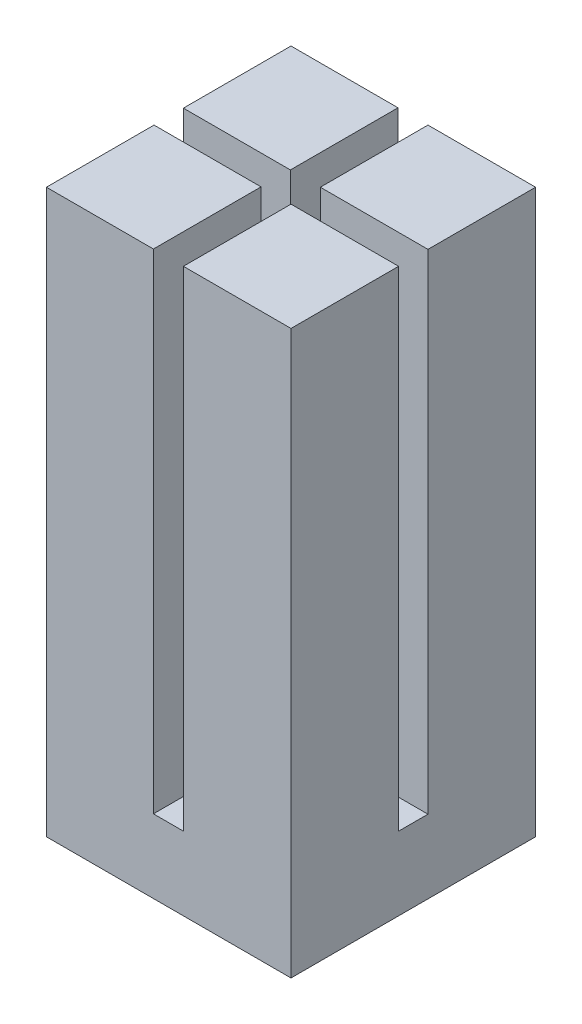
ISO-10303-21;
HEADER;
FILE_DESCRIPTION(('STEP AP214'),'2;1');
FILE_NAME('part.step','',(''),(''),'','','');
FILE_SCHEMA(('AUTOMOTIVE_DESIGN { 1 0 10303 214 1 1 1 1 }'));
ENDSEC;
DATA;
#1=APPLICATION_CONTEXT('core data for automotive mechanical design processes');
#2=APPLICATION_PROTOCOL_DEFINITION('international standard','automotive_design',2000,#1);
#3=PRODUCT_CONTEXT('',#1,'mechanical');
#4=PRODUCT('Part','Part','',(#3));
#5=PRODUCT_RELATED_PRODUCT_CATEGORY('part','',(#4));
#6=PRODUCT_DEFINITION_FORMATION('','',#4);
#7=PRODUCT_DEFINITION_CONTEXT('part definition',#1,'design');
#8=PRODUCT_DEFINITION('design','',#6,#7);
#9=PRODUCT_DEFINITION_SHAPE('','',#8);
#10=(LENGTH_UNIT() NAMED_UNIT(*) SI_UNIT(.MILLI.,.METRE.));
#11=(NAMED_UNIT(*) PLANE_ANGLE_UNIT() SI_UNIT($,.RADIAN.));
#12=(NAMED_UNIT(*) SI_UNIT($,.STERADIAN.) SOLID_ANGLE_UNIT());
#13=UNCERTAINTY_MEASURE_WITH_UNIT(LENGTH_MEASURE(1.E-05),#10,'distance_accuracy_value','');
#14=(GEOMETRIC_REPRESENTATION_CONTEXT(3) GLOBAL_UNCERTAINTY_ASSIGNED_CONTEXT((#13)) GLOBAL_UNIT_ASSIGNED_CONTEXT((#10,
#11,#12)) REPRESENTATION_CONTEXT('',''));
#15=CARTESIAN_POINT('',(0.,0.,0.));
#16=DIRECTION('',(0.,0.,1.));
#17=DIRECTION('',(1.,0.,0.));
#18=AXIS2_PLACEMENT_3D('',#15,#16,#17);
#19=CARTESIAN_POINT('',(-12.7,50.8,0.));
#20=DIRECTION('',(1.,0.,0.));
#21=DIRECTION('',(0.,0.,-1.));
#22=AXIS2_PLACEMENT_3D('',#19,#20,#21);
#23=PLANE('',#22);
#24=DIRECTION('',(0.,-1.,0.));
#25=VECTOR('',#24,1.);
#26=CARTESIAN_POINT('',(-12.7,50.8,-12.7));
#27=LINE('',#26,#25);
#28=CARTESIAN_POINT('',(-12.7,50.8,-12.7));
#29=VERTEX_POINT('',#28);
#30=CARTESIAN_POINT('',(-12.7,-7.62,-12.7));
#31=VERTEX_POINT('',#30);
#32=EDGE_CURVE('E320',#29,#31,#27,.T.);
#33=ORIENTED_EDGE('',*,*,#32,.T.);
#34=DIRECTION('',(0.,0.,1.));
#35=VECTOR('',#34,1.);
#36=CARTESIAN_POINT('',(-12.7,-7.62,-12.7));
#37=LINE('',#36,#35);
#38=CARTESIAN_POINT('',(-12.7,-7.62,12.7));
#39=VERTEX_POINT('',#38);
#40=EDGE_CURVE('E280',#31,#39,#37,.T.);
#41=ORIENTED_EDGE('',*,*,#40,.T.);
#42=DIRECTION('',(0.,1.,0.));
#43=VECTOR('',#42,1.);
#44=CARTESIAN_POINT('',(-12.7,-7.62,12.7));
#45=LINE('',#44,#43);
#46=CARTESIAN_POINT('',(-12.7,50.8,12.7));
#47=VERTEX_POINT('',#46);
#48=EDGE_CURVE('E284',#39,#47,#45,.T.);
#49=ORIENTED_EDGE('',*,*,#48,.T.);
#50=DIRECTION('',(0.,0.,1.));
#51=VECTOR('',#50,1.);
#52=CARTESIAN_POINT('',(-12.7,50.8,0.));
#53=LINE('',#52,#51);
#54=CARTESIAN_POINT('',(-12.7,50.8,1.524));
#55=VERTEX_POINT('',#54);
#56=EDGE_CURVE('E239',#55,#47,#53,.T.);
#57=ORIENTED_EDGE('',*,*,#56,.F.);
#58=DIRECTION('',(0.,-1.,0.));
#59=VECTOR('',#58,1.);
#60=CARTESIAN_POINT('',(-12.7,50.8,1.524));
#61=LINE('',#60,#59);
#62=CARTESIAN_POINT('',(-12.7,0.,1.524));
#63=VERTEX_POINT('',#62);
#64=EDGE_CURVE('E264',#55,#63,#61,.T.);
#65=ORIENTED_EDGE('',*,*,#64,.T.);
#66=DIRECTION('',(0.,0.,1.));
#67=VECTOR('',#66,1.);
#68=CARTESIAN_POINT('',(-12.7,0.,-12.7));
#69=LINE('',#68,#67);
#70=CARTESIAN_POINT('',(-12.7,0.,-1.52399999999999));
#71=VERTEX_POINT('',#70);
#72=EDGE_CURVE('E274',#71,#63,#69,.T.);
#73=ORIENTED_EDGE('',*,*,#72,.F.);
#74=DIRECTION('',(0.,-1.,0.));
#75=VECTOR('',#74,1.);
#76=CARTESIAN_POINT('',(-12.7,50.8,-1.52399999999999));
#77=LINE('',#76,#75);
#78=CARTESIAN_POINT('',(-12.7,50.8,-1.52399999999999));
#79=VERTEX_POINT('',#78);
#80=EDGE_CURVE('E11',#79,#71,#77,.T.);
#81=ORIENTED_EDGE('',*,*,#80,.F.);
#82=DIRECTION('',(0.,0.,1.));
#83=VECTOR('',#82,1.);
#84=CARTESIAN_POINT('',(-12.7,50.8,0.));
#85=LINE('',#84,#83);
#86=EDGE_CURVE('E304',#29,#79,#85,.T.);
#87=ORIENTED_EDGE('',*,*,#86,.F.);
#88=EDGE_LOOP('',(#33,#41,#49,#57,#65,#73,#81,#87));
#89=FACE_BOUND('',#88,.T.);
#90=ADVANCED_FACE('F47',(#89),#23,.F.);
#91=CARTESIAN_POINT('',(0.,50.8,-1.524));
#92=DIRECTION('',(0.,0.,-1.));
#93=DIRECTION('',(-1.,0.,0.));
#94=AXIS2_PLACEMENT_3D('',#91,#92,#93);
#95=PLANE('',#94);
#96=DIRECTION('',(1.,0.,0.));
#97=VECTOR('',#96,1.);
#98=CARTESIAN_POINT('',(0.,0.,-1.524));
#99=LINE('',#98,#97);
#100=CARTESIAN_POINT('',(-1.5875,0.,-1.52399999999999));
#101=VERTEX_POINT('',#100);
#102=EDGE_CURVE('E303',#71,#101,#99,.T.);
#103=ORIENTED_EDGE('',*,*,#102,.T.);
#104=DIRECTION('',(0.,-1.,0.));
#105=VECTOR('',#104,1.);
#106=CARTESIAN_POINT('',(-1.5875,50.8,-1.52399999999999));
#107=LINE('',#106,#105);
#108=CARTESIAN_POINT('',(-1.5875,50.8,-1.52399999999999));
#109=VERTEX_POINT('',#108);
#110=EDGE_CURVE('E55',#109,#101,#107,.T.);
#111=ORIENTED_EDGE('',*,*,#110,.F.);
#112=DIRECTION('',(1.,0.,0.));
#113=VECTOR('',#112,1.);
#114=CARTESIAN_POINT('',(0.,50.8,-1.524));
#115=LINE('',#114,#113);
#116=EDGE_CURVE('E308',#79,#109,#115,.T.);
#117=ORIENTED_EDGE('',*,*,#116,.F.);
#118=ORIENTED_EDGE('',*,*,#80,.T.);
#119=EDGE_LOOP('',(#103,#111,#117,#118));
#120=FACE_BOUND('',#119,.T.);
#121=ADVANCED_FACE('F339',(#120),#95,.F.);
#122=CARTESIAN_POINT('',(-1.5875,50.8,0.));
#123=DIRECTION('',(1.,0.,0.));
#124=DIRECTION('',(0.,0.,-1.));
#125=AXIS2_PLACEMENT_3D('',#122,#123,#124);
#126=PLANE('',#125);
#127=DIRECTION('',(0.,0.,1.));
#128=VECTOR('',#127,1.);
#129=CARTESIAN_POINT('',(-1.5875,0.,0.));
#130=LINE('',#129,#128);
#131=CARTESIAN_POINT('',(-1.5875,0.,-12.7));
#132=VERTEX_POINT('',#131);
#133=EDGE_CURVE('E309',#132,#101,#130,.T.);
#134=ORIENTED_EDGE('',*,*,#133,.F.);
#135=DIRECTION('',(0.,-1.,0.));
#136=VECTOR('',#135,1.);
#137=CARTESIAN_POINT('',(-1.5875,50.8,-12.7));
#138=LINE('',#137,#136);
#139=CARTESIAN_POINT('',(-1.5875,50.8,-12.7));
#140=VERTEX_POINT('',#139);
#141=EDGE_CURVE('E328',#140,#132,#138,.T.);
#142=ORIENTED_EDGE('',*,*,#141,.F.);
#143=DIRECTION('',(0.,0.,1.));
#144=VECTOR('',#143,1.);
#145=CARTESIAN_POINT('',(-1.5875,50.8,0.));
#146=LINE('',#145,#144);
#147=EDGE_CURVE('E312',#140,#109,#146,.T.);
#148=ORIENTED_EDGE('',*,*,#147,.T.);
#149=ORIENTED_EDGE('',*,*,#110,.T.);
#150=EDGE_LOOP('',(#134,#142,#148,#149));
#151=FACE_BOUND('',#150,.T.);
#152=ADVANCED_FACE('F336',(#151),#126,.T.);
#153=CARTESIAN_POINT('',(0.,50.8,-12.7));
#154=DIRECTION('',(0.,0.,-1.));
#155=DIRECTION('',(-1.,0.,0.));
#156=AXIS2_PLACEMENT_3D('',#153,#154,#155);
#157=PLANE('',#156);
#158=ORIENTED_EDGE('',*,*,#141,.T.);
#159=DIRECTION('',(1.,0.,0.));
#160=VECTOR('',#159,1.);
#161=CARTESIAN_POINT('',(-12.7,0.,-12.7));
#162=LINE('',#161,#160);
#163=CARTESIAN_POINT('',(1.524,0.,-12.7));
#164=VERTEX_POINT('',#163);
#165=EDGE_CURVE('E268',#132,#164,#162,.T.);
#166=ORIENTED_EDGE('',*,*,#165,.T.);
#167=DIRECTION('',(0.,-1.,0.));
#168=VECTOR('',#167,1.);
#169=CARTESIAN_POINT('',(1.524,50.8,-12.7));
#170=LINE('',#169,#168);
#171=CARTESIAN_POINT('',(1.524,50.8,-12.7));
#172=VERTEX_POINT('',#171);
#173=EDGE_CURVE('E219',#172,#164,#170,.T.);
#174=ORIENTED_EDGE('',*,*,#173,.F.);
#175=DIRECTION('',(1.,0.,0.));
#176=VECTOR('',#175,1.);
#177=CARTESIAN_POINT('',(0.,50.8,-12.7));
#178=LINE('',#177,#176);
#179=CARTESIAN_POINT('',(12.7,50.8,-12.7));
#180=VERTEX_POINT('',#179);
#181=EDGE_CURVE('E215',#172,#180,#178,.T.);
#182=ORIENTED_EDGE('',*,*,#181,.T.);
#183=DIRECTION('',(0.,1.,0.));
#184=VECTOR('',#183,1.);
#185=CARTESIAN_POINT('',(12.7,-7.62,-12.7));
#186=LINE('',#185,#184);
#187=CARTESIAN_POINT('',(12.7,-7.62,-12.7));
#188=VERTEX_POINT('',#187);
#189=EDGE_CURVE('E300',#188,#180,#186,.T.);
#190=ORIENTED_EDGE('',*,*,#189,.F.);
#191=DIRECTION('',(1.,0.,0.));
#192=VECTOR('',#191,1.);
#193=CARTESIAN_POINT('',(-12.7,-7.62,-12.7));
#194=LINE('',#193,#192);
#195=EDGE_CURVE('E269',#31,#188,#194,.T.);
#196=ORIENTED_EDGE('',*,*,#195,.F.);
#197=ORIENTED_EDGE('',*,*,#32,.F.);
#198=DIRECTION('',(1.,0.,0.));
#199=VECTOR('',#198,1.);
#200=CARTESIAN_POINT('',(0.,50.8,-12.7));
#201=LINE('',#200,#199);
#202=EDGE_CURVE('E316',#29,#140,#201,.T.);
#203=ORIENTED_EDGE('',*,*,#202,.T.);
#204=EDGE_LOOP('',(#158,#166,#174,#182,#190,#196,#197,#203));
#205=FACE_BOUND('',#204,.T.);
#206=ADVANCED_FACE('F377',(#205),#157,.T.);
#207=CARTESIAN_POINT('',(0.,50.8,0.));
#208=DIRECTION('',(0.,1.,0.));
#209=DIRECTION('',(0.,0.,1.));
#210=AXIS2_PLACEMENT_3D('',#207,#208,#209);
#211=PLANE('',#210);
#212=ORIENTED_EDGE('',*,*,#86,.T.);
#213=ORIENTED_EDGE('',*,*,#116,.T.);
#214=ORIENTED_EDGE('',*,*,#147,.F.);
#215=ORIENTED_EDGE('',*,*,#202,.F.);
#216=EDGE_LOOP('',(#212,#213,#214,#215));
#217=FACE_BOUND('',#216,.T.);
#218=ADVANCED_FACE('F382',(#217),#211,.T.);
#219=CARTESIAN_POINT('',(0.,0.,0.));
#220=DIRECTION('',(0.,-1.,0.));
#221=DIRECTION('',(0.,0.,-1.));
#222=AXIS2_PLACEMENT_3D('',#219,#220,#221);
#223=PLANE('',#222);
#224=DIRECTION('',(1.,0.,0.));
#225=VECTOR('',#224,1.);
#226=CARTESIAN_POINT('',(-12.7,0.,12.7));
#227=LINE('',#226,#225);
#228=CARTESIAN_POINT('',(-1.5875,0.,12.7));
#229=VERTEX_POINT('',#228);
#230=CARTESIAN_POINT('',(1.524,0.,12.7));
#231=VERTEX_POINT('',#230);
#232=EDGE_CURVE('E291',#229,#231,#227,.T.);
#233=ORIENTED_EDGE('',*,*,#232,.T.);
#234=DIRECTION('',(0.,0.,-1.));
#235=VECTOR('',#234,1.);
#236=CARTESIAN_POINT('',(1.524,0.,0.));
#237=LINE('',#236,#235);
#238=CARTESIAN_POINT('',(1.524,0.,1.524));
#239=VERTEX_POINT('',#238);
#240=EDGE_CURVE('E62',#231,#239,#237,.T.);
#241=ORIENTED_EDGE('',*,*,#240,.T.);
#242=DIRECTION('',(1.,0.,0.));
#243=VECTOR('',#242,1.);
#244=CARTESIAN_POINT('',(0.,0.,1.524));
#245=LINE('',#244,#243);
#246=CARTESIAN_POINT('',(12.7,0.,1.524));
#247=VERTEX_POINT('',#246);
#248=EDGE_CURVE('E67',#239,#247,#245,.T.);
#249=ORIENTED_EDGE('',*,*,#248,.T.);
#250=DIRECTION('',(0.,0.,1.));
#251=VECTOR('',#250,1.);
#252=CARTESIAN_POINT('',(12.7,0.,-12.7));
#253=LINE('',#252,#251);
#254=CARTESIAN_POINT('',(12.7,0.,-1.524));
#255=VERTEX_POINT('',#254);
#256=EDGE_CURVE('E288',#255,#247,#253,.T.);
#257=ORIENTED_EDGE('',*,*,#256,.F.);
#258=DIRECTION('',(1.,0.,0.));
#259=VECTOR('',#258,1.);
#260=CARTESIAN_POINT('',(0.,0.,-1.524));
#261=LINE('',#260,#259);
#262=CARTESIAN_POINT('',(1.524,0.,-1.524));
#263=VERTEX_POINT('',#262);
#264=EDGE_CURVE('E208',#263,#255,#261,.T.);
#265=ORIENTED_EDGE('',*,*,#264,.F.);
#266=DIRECTION('',(0.,0.,-1.));
#267=VECTOR('',#266,1.);
#268=CARTESIAN_POINT('',(1.524,0.,0.));
#269=LINE('',#268,#267);
#270=EDGE_CURVE('E168',#263,#164,#269,.T.);
#271=ORIENTED_EDGE('',*,*,#270,.T.);
#272=ORIENTED_EDGE('',*,*,#165,.F.);
#273=ORIENTED_EDGE('',*,*,#133,.T.);
#274=ORIENTED_EDGE('',*,*,#102,.F.);
#275=ORIENTED_EDGE('',*,*,#72,.T.);
#276=DIRECTION('',(1.,0.,0.));
#277=VECTOR('',#276,1.);
#278=CARTESIAN_POINT('',(0.,0.,1.524));
#279=LINE('',#278,#277);
#280=CARTESIAN_POINT('',(-1.5875,0.,1.524));
#281=VERTEX_POINT('',#280);
#282=EDGE_CURVE('E234',#63,#281,#279,.T.);
#283=ORIENTED_EDGE('',*,*,#282,.T.);
#284=DIRECTION('',(0.,0.,1.));
#285=VECTOR('',#284,1.);
#286=CARTESIAN_POINT('',(-1.5875,0.,0.));
#287=LINE('',#286,#285);
#288=EDGE_CURVE('E240',#281,#229,#287,.T.);
#289=ORIENTED_EDGE('',*,*,#288,.T.);
#290=EDGE_LOOP('',(#233,#241,#249,#257,#265,#271,#272,#273,#274,#275,#283,#289));
#291=FACE_BOUND('',#290,.T.);
#292=ADVANCED_FACE('F342',(#291),#223,.F.);
#293=CARTESIAN_POINT('',(12.7,-7.62,-12.7));
#294=DIRECTION('',(-1.,0.,0.));
#295=DIRECTION('',(0.,0.,1.));
#296=AXIS2_PLACEMENT_3D('',#293,#294,#295);
#297=PLANE('',#296);
#298=ORIENTED_EDGE('',*,*,#189,.T.);
#299=DIRECTION('',(0.,0.,1.));
#300=VECTOR('',#299,1.);
#301=CARTESIAN_POINT('',(12.7,50.8,0.));
#302=LINE('',#301,#300);
#303=CARTESIAN_POINT('',(12.7,50.8,-1.524));
#304=VERTEX_POINT('',#303);
#305=EDGE_CURVE('E211',#180,#304,#302,.T.);
#306=ORIENTED_EDGE('',*,*,#305,.T.);
#307=DIRECTION('',(0.,-1.,0.));
#308=VECTOR('',#307,1.);
#309=CARTESIAN_POINT('',(12.7,50.8,-1.524));
#310=LINE('',#309,#308);
#311=EDGE_CURVE('E227',#304,#255,#310,.T.);
#312=ORIENTED_EDGE('',*,*,#311,.T.);
#313=ORIENTED_EDGE('',*,*,#256,.T.);
#314=DIRECTION('',(0.,-1.,0.));
#315=VECTOR('',#314,1.);
#316=CARTESIAN_POINT('',(12.7,50.8,1.524));
#317=LINE('',#316,#315);
#318=CARTESIAN_POINT('',(12.7,50.8,1.524));
#319=VERTEX_POINT('',#318);
#320=EDGE_CURVE('E169',#319,#247,#317,.T.);
#321=ORIENTED_EDGE('',*,*,#320,.F.);
#322=DIRECTION('',(0.,0.,1.));
#323=VECTOR('',#322,1.);
#324=CARTESIAN_POINT('',(12.7,50.8,0.));
#325=LINE('',#324,#323);
#326=CARTESIAN_POINT('',(12.7,50.8,12.7));
#327=VERTEX_POINT('',#326);
#328=EDGE_CURVE('E181',#319,#327,#325,.T.);
#329=ORIENTED_EDGE('',*,*,#328,.T.);
#330=DIRECTION('',(0.,1.,0.));
#331=VECTOR('',#330,1.);
#332=CARTESIAN_POINT('',(12.7,-7.62,12.7));
#333=LINE('',#332,#331);
#334=CARTESIAN_POINT('',(12.7,-7.62,12.7));
#335=VERTEX_POINT('',#334);
#336=EDGE_CURVE('E176',#335,#327,#333,.T.);
#337=ORIENTED_EDGE('',*,*,#336,.F.);
#338=DIRECTION('',(0.,0.,1.));
#339=VECTOR('',#338,1.);
#340=CARTESIAN_POINT('',(12.7,-7.62,-12.7));
#341=LINE('',#340,#339);
#342=EDGE_CURVE('E273',#188,#335,#341,.T.);
#343=ORIENTED_EDGE('',*,*,#342,.F.);
#344=EDGE_LOOP('',(#298,#306,#312,#313,#321,#329,#337,#343));
#345=FACE_BOUND('',#344,.T.);
#346=ADVANCED_FACE('F387',(#345),#297,.F.);
#347=CARTESIAN_POINT('',(-12.7,-7.62,12.7));
#348=DIRECTION('',(0.,0.,1.));
#349=DIRECTION('',(1.,0.,0.));
#350=AXIS2_PLACEMENT_3D('',#347,#348,#349);
#351=PLANE('',#350);
#352=ORIENTED_EDGE('',*,*,#232,.F.);
#353=DIRECTION('',(0.,-1.,0.));
#354=VECTOR('',#353,1.);
#355=CARTESIAN_POINT('',(-1.5875,50.8,12.7));
#356=LINE('',#355,#354);
#357=CARTESIAN_POINT('',(-1.5875,50.8,12.7));
#358=VERTEX_POINT('',#357);
#359=EDGE_CURVE('E260',#358,#229,#356,.T.);
#360=ORIENTED_EDGE('',*,*,#359,.F.);
#361=DIRECTION('',(1.,0.,0.));
#362=VECTOR('',#361,1.);
#363=CARTESIAN_POINT('',(0.,50.8,12.7));
#364=LINE('',#363,#362);
#365=EDGE_CURVE('E244',#47,#358,#364,.T.);
#366=ORIENTED_EDGE('',*,*,#365,.F.);
#367=ORIENTED_EDGE('',*,*,#48,.F.);
#368=DIRECTION('',(1.,0.,0.));
#369=VECTOR('',#368,1.);
#370=CARTESIAN_POINT('',(-12.7,-7.62,12.7));
#371=LINE('',#370,#369);
#372=EDGE_CURVE('E277',#39,#335,#371,.T.);
#373=ORIENTED_EDGE('',*,*,#372,.T.);
#374=ORIENTED_EDGE('',*,*,#336,.T.);
#375=DIRECTION('',(1.,0.,0.));
#376=VECTOR('',#375,1.);
#377=CARTESIAN_POINT('',(0.,50.8,12.7));
#378=LINE('',#377,#376);
#379=CARTESIAN_POINT('',(1.524,50.8,12.7));
#380=VERTEX_POINT('',#379);
#381=EDGE_CURVE('E172',#380,#327,#378,.T.);
#382=ORIENTED_EDGE('',*,*,#381,.F.);
#383=DIRECTION('',(0.,-1.,0.));
#384=VECTOR('',#383,1.);
#385=CARTESIAN_POINT('',(1.524,50.8,12.7));
#386=LINE('',#385,#384);
#387=EDGE_CURVE('E160',#380,#231,#386,.T.);
#388=ORIENTED_EDGE('',*,*,#387,.T.);
#389=EDGE_LOOP('',(#352,#360,#366,#367,#373,#374,#382,#388));
#390=FACE_BOUND('',#389,.T.);
#391=ADVANCED_FACE('F173',(#390),#351,.T.);
#392=CARTESIAN_POINT('',(0.,-7.62,0.));
#393=DIRECTION('',(0.,-1.,0.));
#394=DIRECTION('',(0.,0.,-1.));
#395=AXIS2_PLACEMENT_3D('',#392,#393,#394);
#396=PLANE('',#395);
#397=ORIENTED_EDGE('',*,*,#195,.T.);
#398=ORIENTED_EDGE('',*,*,#342,.T.);
#399=ORIENTED_EDGE('',*,*,#372,.F.);
#400=ORIENTED_EDGE('',*,*,#40,.F.);
#401=EDGE_LOOP('',(#397,#398,#399,#400));
#402=FACE_BOUND('',#401,.T.);
#403=ADVANCED_FACE('F393',(#402),#396,.T.);
#404=CARTESIAN_POINT('',(0.,50.8,1.524));
#405=DIRECTION('',(0.,0.,-1.));
#406=DIRECTION('',(-1.,0.,0.));
#407=AXIS2_PLACEMENT_3D('',#404,#405,#406);
#408=PLANE('',#407);
#409=ORIENTED_EDGE('',*,*,#282,.F.);
#410=ORIENTED_EDGE('',*,*,#64,.F.);
#411=DIRECTION('',(1.,0.,0.));
#412=VECTOR('',#411,1.);
#413=CARTESIAN_POINT('',(0.,50.8,1.524));
#414=LINE('',#413,#412);
#415=CARTESIAN_POINT('',(-1.5875,50.8,1.524));
#416=VERTEX_POINT('',#415);
#417=EDGE_CURVE('E235',#55,#416,#414,.T.);
#418=ORIENTED_EDGE('',*,*,#417,.T.);
#419=DIRECTION('',(0.,-1.,0.));
#420=VECTOR('',#419,1.);
#421=CARTESIAN_POINT('',(-1.5875,50.8,1.524));
#422=LINE('',#421,#420);
#423=EDGE_CURVE('E251',#416,#281,#422,.T.);
#424=ORIENTED_EDGE('',*,*,#423,.T.);
#425=EDGE_LOOP('',(#409,#410,#418,#424));
#426=FACE_BOUND('',#425,.T.);
#427=ADVANCED_FACE('F349',(#426),#408,.T.);
#428=CARTESIAN_POINT('',(-1.5875,50.8,0.));
#429=DIRECTION('',(1.,0.,0.));
#430=DIRECTION('',(0.,0.,-1.));
#431=AXIS2_PLACEMENT_3D('',#428,#429,#430);
#432=PLANE('',#431);
#433=ORIENTED_EDGE('',*,*,#288,.F.);
#434=ORIENTED_EDGE('',*,*,#423,.F.);
#435=DIRECTION('',(0.,0.,1.));
#436=VECTOR('',#435,1.);
#437=CARTESIAN_POINT('',(-1.5875,50.8,0.));
#438=LINE('',#437,#436);
#439=EDGE_CURVE('E247',#416,#358,#438,.T.);
#440=ORIENTED_EDGE('',*,*,#439,.T.);
#441=ORIENTED_EDGE('',*,*,#359,.T.);
#442=EDGE_LOOP('',(#433,#434,#440,#441));
#443=FACE_BOUND('',#442,.T.);
#444=ADVANCED_FACE('F353',(#443),#432,.T.);
#445=CARTESIAN_POINT('',(0.,50.8,0.));
#446=DIRECTION('',(0.,1.,0.));
#447=DIRECTION('',(0.,0.,1.));
#448=AXIS2_PLACEMENT_3D('',#445,#446,#447);
#449=PLANE('',#448);
#450=ORIENTED_EDGE('',*,*,#417,.F.);
#451=ORIENTED_EDGE('',*,*,#56,.T.);
#452=ORIENTED_EDGE('',*,*,#365,.T.);
#453=ORIENTED_EDGE('',*,*,#439,.F.);
#454=EDGE_LOOP('',(#450,#451,#452,#453));
#455=FACE_BOUND('',#454,.T.);
#456=ADVANCED_FACE('F358',(#455),#449,.T.);
#457=CARTESIAN_POINT('',(1.524,50.8,0.));
#458=DIRECTION('',(-1.,0.,0.));
#459=DIRECTION('',(0.,0.,1.));
#460=AXIS2_PLACEMENT_3D('',#457,#458,#459);
#461=PLANE('',#460);
#462=ORIENTED_EDGE('',*,*,#270,.F.);
#463=DIRECTION('',(0.,-1.,0.));
#464=VECTOR('',#463,1.);
#465=CARTESIAN_POINT('',(1.524,50.8,-1.524));
#466=LINE('',#465,#464);
#467=CARTESIAN_POINT('',(1.524,50.8,-1.524));
#468=VERTEX_POINT('',#467);
#469=EDGE_CURVE('E231',#468,#263,#466,.T.);
#470=ORIENTED_EDGE('',*,*,#469,.F.);
#471=DIRECTION('',(0.,0.,-1.));
#472=VECTOR('',#471,1.);
#473=CARTESIAN_POINT('',(1.524,50.8,0.));
#474=LINE('',#473,#472);
#475=EDGE_CURVE('E203',#468,#172,#474,.T.);
#476=ORIENTED_EDGE('',*,*,#475,.T.);
#477=ORIENTED_EDGE('',*,*,#173,.T.);
#478=EDGE_LOOP('',(#462,#470,#476,#477));
#479=FACE_BOUND('',#478,.T.);
#480=ADVANCED_FACE('F360',(#479),#461,.T.);
#481=CARTESIAN_POINT('',(0.,50.8,-1.524));
#482=DIRECTION('',(0.,0.,-1.));
#483=DIRECTION('',(-1.,0.,0.));
#484=AXIS2_PLACEMENT_3D('',#481,#482,#483);
#485=PLANE('',#484);
#486=ORIENTED_EDGE('',*,*,#264,.T.);
#487=ORIENTED_EDGE('',*,*,#311,.F.);
#488=DIRECTION('',(1.,0.,0.));
#489=VECTOR('',#488,1.);
#490=CARTESIAN_POINT('',(0.,50.8,-1.524));
#491=LINE('',#490,#489);
#492=EDGE_CURVE('E207',#468,#304,#491,.T.);
#493=ORIENTED_EDGE('',*,*,#492,.F.);
#494=ORIENTED_EDGE('',*,*,#469,.T.);
#495=EDGE_LOOP('',(#486,#487,#493,#494));
#496=FACE_BOUND('',#495,.T.);
#497=ADVANCED_FACE('F366',(#496),#485,.F.);
#498=CARTESIAN_POINT('',(0.,50.8,0.));
#499=DIRECTION('',(0.,1.,0.));
#500=DIRECTION('',(0.,0.,1.));
#501=AXIS2_PLACEMENT_3D('',#498,#499,#500);
#502=PLANE('',#501);
#503=ORIENTED_EDGE('',*,*,#475,.F.);
#504=ORIENTED_EDGE('',*,*,#492,.T.);
#505=ORIENTED_EDGE('',*,*,#305,.F.);
#506=ORIENTED_EDGE('',*,*,#181,.F.);
#507=EDGE_LOOP('',(#503,#504,#505,#506));
#508=FACE_BOUND('',#507,.T.);
#509=ADVANCED_FACE('F428',(#508),#502,.T.);
#510=CARTESIAN_POINT('',(1.524,50.8,0.));
#511=DIRECTION('',(-1.,0.,0.));
#512=DIRECTION('',(0.,0.,1.));
#513=AXIS2_PLACEMENT_3D('',#510,#511,#512);
#514=PLANE('',#513);
#515=ORIENTED_EDGE('',*,*,#240,.F.);
#516=ORIENTED_EDGE('',*,*,#387,.F.);
#517=DIRECTION('',(0.,0.,-1.));
#518=VECTOR('',#517,1.);
#519=CARTESIAN_POINT('',(1.524,50.8,0.));
#520=LINE('',#519,#518);
#521=CARTESIAN_POINT('',(1.524,50.8,1.524));
#522=VERTEX_POINT('',#521);
#523=EDGE_CURVE('E164',#380,#522,#520,.T.);
#524=ORIENTED_EDGE('',*,*,#523,.T.);
#525=DIRECTION('',(0.,-1.,0.));
#526=VECTOR('',#525,1.);
#527=CARTESIAN_POINT('',(1.524,50.8,1.524));
#528=LINE('',#527,#526);
#529=EDGE_CURVE('E195',#522,#239,#528,.T.);
#530=ORIENTED_EDGE('',*,*,#529,.T.);
#531=EDGE_LOOP('',(#515,#516,#524,#530));
#532=FACE_BOUND('',#531,.T.);
#533=ADVANCED_FACE('F162',(#532),#514,.T.);
#534=CARTESIAN_POINT('',(0.,50.8,1.524));
#535=DIRECTION('',(0.,0.,-1.));
#536=DIRECTION('',(-1.,0.,0.));
#537=AXIS2_PLACEMENT_3D('',#534,#535,#536);
#538=PLANE('',#537);
#539=ORIENTED_EDGE('',*,*,#248,.F.);
#540=ORIENTED_EDGE('',*,*,#529,.F.);
#541=DIRECTION('',(1.,0.,0.));
#542=VECTOR('',#541,1.);
#543=CARTESIAN_POINT('',(0.,50.8,1.524));
#544=LINE('',#543,#542);
#545=EDGE_CURVE('E185',#522,#319,#544,.T.);
#546=ORIENTED_EDGE('',*,*,#545,.T.);
#547=ORIENTED_EDGE('',*,*,#320,.T.);
#548=EDGE_LOOP('',(#539,#540,#546,#547));
#549=FACE_BOUND('',#548,.T.);
#550=ADVANCED_FACE('F448',(#549),#538,.T.);
#551=CARTESIAN_POINT('',(0.,50.8,0.));
#552=DIRECTION('',(0.,1.,0.));
#553=DIRECTION('',(0.,0.,1.));
#554=AXIS2_PLACEMENT_3D('',#551,#552,#553);
#555=PLANE('',#554);
#556=ORIENTED_EDGE('',*,*,#523,.F.);
#557=ORIENTED_EDGE('',*,*,#381,.T.);
#558=ORIENTED_EDGE('',*,*,#328,.F.);
#559=ORIENTED_EDGE('',*,*,#545,.F.);
#560=EDGE_LOOP('',(#556,#557,#558,#559));
#561=FACE_BOUND('',#560,.T.);
#562=ADVANCED_FACE('F183',(#561),#555,.T.);
#563=CLOSED_SHELL('',(#90,#121,#152,#206,#218,#292,#346,#391,#403,#427,#444,#456,#480,#497,#509,
#533,#550,#562));
#564=MANIFOLD_SOLID_BREP('B2',#563);
#565=ADVANCED_BREP_SHAPE_REPRESENTATION('',(#18,#564),#14);
#566=SHAPE_DEFINITION_REPRESENTATION(#9,#565);
ENDSEC;
END-ISO-10303-21;
